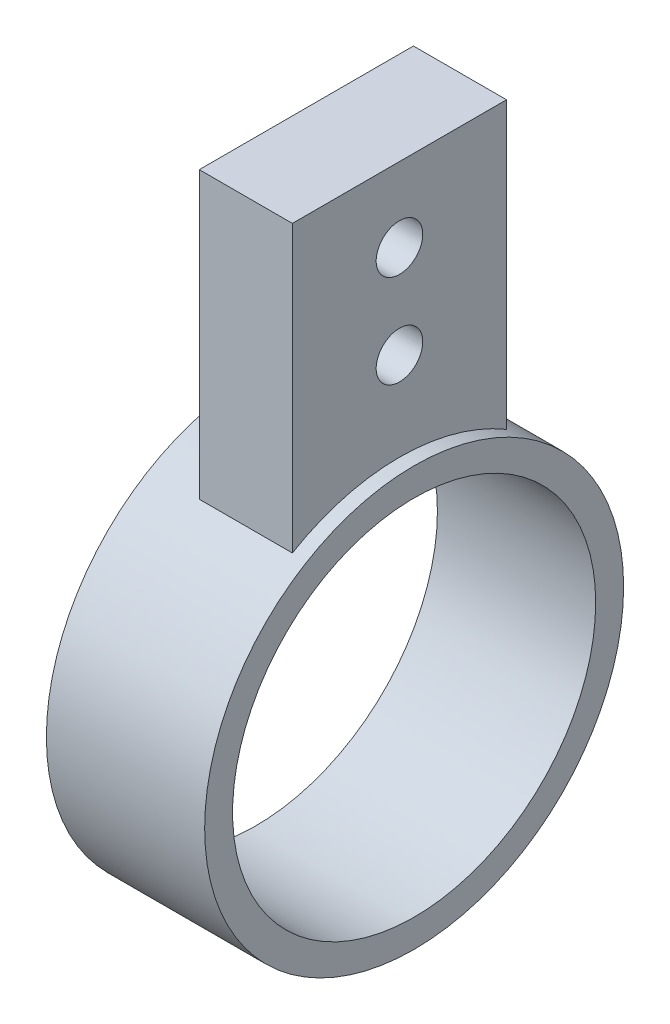
ISO-10303-21;
HEADER;
FILE_DESCRIPTION(('STEP AP214'),'2;1');
FILE_NAME('part.step','',(''),(''),'','','');
FILE_SCHEMA(('AUTOMOTIVE_DESIGN { 1 0 10303 214 1 1 1 1 }'));
ENDSEC;
DATA;
#1=APPLICATION_CONTEXT('core data for automotive mechanical design processes');
#2=APPLICATION_PROTOCOL_DEFINITION('international standard','automotive_design',2000,#1);
#3=PRODUCT_CONTEXT('',#1,'mechanical');
#4=PRODUCT('Part','Part','',(#3));
#5=PRODUCT_RELATED_PRODUCT_CATEGORY('part','',(#4));
#6=PRODUCT_DEFINITION_FORMATION('','',#4);
#7=PRODUCT_DEFINITION_CONTEXT('part definition',#1,'design');
#8=PRODUCT_DEFINITION('design','',#6,#7);
#9=PRODUCT_DEFINITION_SHAPE('','',#8);
#10=(LENGTH_UNIT() NAMED_UNIT(*) SI_UNIT(.MILLI.,.METRE.));
#11=(NAMED_UNIT(*) PLANE_ANGLE_UNIT() SI_UNIT($,.RADIAN.));
#12=(NAMED_UNIT(*) SI_UNIT($,.STERADIAN.) SOLID_ANGLE_UNIT());
#13=UNCERTAINTY_MEASURE_WITH_UNIT(LENGTH_MEASURE(1.E-05),#10,'distance_accuracy_value','');
#14=(GEOMETRIC_REPRESENTATION_CONTEXT(3) GLOBAL_UNCERTAINTY_ASSIGNED_CONTEXT((#13)) GLOBAL_UNIT_ASSIGNED_CONTEXT((#10,
#11,#12)) REPRESENTATION_CONTEXT('',''));
#15=CARTESIAN_POINT('',(0.,0.,0.));
#16=DIRECTION('',(0.,0.,1.));
#17=DIRECTION('',(1.,0.,0.));
#18=AXIS2_PLACEMENT_3D('',#15,#16,#17);
#19=CARTESIAN_POINT('',(8.5,0.,0.));
#20=DIRECTION('',(-1.,0.,0.));
#21=DIRECTION('',(0.,0.,1.));
#22=AXIS2_PLACEMENT_3D('',#19,#20,#21);
#23=CYLINDRICAL_SURFACE('',#22,22.5);
#24=DIRECTION('',(-1.,0.,0.));
#25=VECTOR('',#24,1.);
#26=CARTESIAN_POINT('',(8.5,19.3390796058137,-11.5));
#27=LINE('',#26,#25);
#28=CARTESIAN_POINT('',(6.92320450000446,19.3390796058137,-11.5));
#29=VERTEX_POINT('',#28);
#30=CARTESIAN_POINT('',(-3.07679549999553,19.3390796058137,-11.5));
#31=VERTEX_POINT('',#30);
#32=EDGE_CURVE('E110',#29,#31,#27,.T.);
#33=ORIENTED_EDGE('',*,*,#32,.F.);
#34=CARTESIAN_POINT('',(6.92320450000447,0.,0.));
#35=DIRECTION('',(1.,0.,0.));
#36=DIRECTION('',(0.,0.,-1.));
#37=AXIS2_PLACEMENT_3D('',#34,#35,#36);
#38=CIRCLE('',#37,22.5);
#39=CARTESIAN_POINT('',(6.92320450000447,19.3390796058137,11.5));
#40=VERTEX_POINT('',#39);
#41=EDGE_CURVE('E58',#40,#29,#38,.F.);
#42=ORIENTED_EDGE('',*,*,#41,.F.);
#43=DIRECTION('',(-1.,0.,0.));
#44=VECTOR('',#43,1.);
#45=CARTESIAN_POINT('',(8.5,19.3390796058137,11.5));
#46=LINE('',#45,#44);
#47=CARTESIAN_POINT('',(-3.07679549999553,19.3390796058137,11.5));
#48=VERTEX_POINT('',#47);
#49=EDGE_CURVE('E105',#48,#40,#46,.F.);
#50=ORIENTED_EDGE('',*,*,#49,.F.);
#51=CARTESIAN_POINT('',(-3.07679549999553,0.,0.));
#52=DIRECTION('',(-1.,0.,0.));
#53=DIRECTION('',(0.,0.,1.));
#54=AXIS2_PLACEMENT_3D('',#51,#52,#53);
#55=CIRCLE('',#54,22.5);
#56=EDGE_CURVE('E82',#31,#48,#55,.F.);
#57=ORIENTED_EDGE('',*,*,#56,.F.);
#58=EDGE_LOOP('',(#33,#42,#50,#57));
#59=FACE_BOUND('',#58,.T.);
#60=CARTESIAN_POINT('',(8.5,0.,0.));
#61=DIRECTION('',(1.,0.,0.));
#62=DIRECTION('',(0.,0.,-1.));
#63=AXIS2_PLACEMENT_3D('',#60,#61,#62);
#64=CIRCLE('',#63,22.5);
#65=CARTESIAN_POINT('',(8.5,0.,-22.5));
#66=VERTEX_POINT('',#65);
#67=EDGE_CURVE('E11',#66,#66,#64,.T.);
#68=ORIENTED_EDGE('',*,*,#67,.F.);
#69=EDGE_LOOP('',(#68));
#70=FACE_BOUND('',#69,.T.);
#71=CARTESIAN_POINT('',(-8.5,0.,0.));
#72=DIRECTION('',(1.,0.,0.));
#73=DIRECTION('',(0.,0.,-1.));
#74=AXIS2_PLACEMENT_3D('',#71,#72,#73);
#75=CIRCLE('',#74,22.5);
#76=CARTESIAN_POINT('',(-8.5,0.,-22.5));
#77=VERTEX_POINT('',#76);
#78=EDGE_CURVE('E42',#77,#77,#75,.T.);
#79=ORIENTED_EDGE('',*,*,#78,.T.);
#80=EDGE_LOOP('',(#79));
#81=FACE_BOUND('',#80,.T.);
#82=ADVANCED_FACE('F34',(#59,#70,#81),#23,.T.);
#83=CARTESIAN_POINT('',(8.5,0.,0.));
#84=DIRECTION('',(1.,0.,0.));
#85=DIRECTION('',(0.,0.,-1.));
#86=AXIS2_PLACEMENT_3D('',#83,#84,#85);
#87=PLANE('',#86);
#88=CARTESIAN_POINT('',(8.5,0.,0.));
#89=DIRECTION('',(1.,0.,0.));
#90=DIRECTION('',(0.,0.,-1.));
#91=AXIS2_PLACEMENT_3D('',#88,#89,#90);
#92=CIRCLE('',#91,19.5);
#93=CARTESIAN_POINT('',(8.5,0.,-19.5));
#94=VERTEX_POINT('',#93);
#95=EDGE_CURVE('E128',#94,#94,#92,.T.);
#96=ORIENTED_EDGE('',*,*,#95,.F.);
#97=EDGE_LOOP('',(#96));
#98=FACE_BOUND('',#97,.T.);
#99=ORIENTED_EDGE('',*,*,#67,.T.);
#100=EDGE_LOOP('',(#99));
#101=FACE_BOUND('',#100,.T.);
#102=ADVANCED_FACE('F144',(#98,#101),#87,.T.);
#103=CARTESIAN_POINT('',(-8.5,0.,0.));
#104=DIRECTION('',(1.,0.,0.));
#105=DIRECTION('',(0.,0.,-1.));
#106=AXIS2_PLACEMENT_3D('',#103,#104,#105);
#107=PLANE('',#106);
#108=CARTESIAN_POINT('',(-8.5,0.,0.));
#109=DIRECTION('',(1.,0.,0.));
#110=DIRECTION('',(0.,0.,-1.));
#111=AXIS2_PLACEMENT_3D('',#108,#109,#110);
#112=CIRCLE('',#111,19.5);
#113=CARTESIAN_POINT('',(-8.5,0.,-19.5));
#114=VERTEX_POINT('',#113);
#115=EDGE_CURVE('E126',#114,#114,#112,.T.);
#116=ORIENTED_EDGE('',*,*,#115,.T.);
#117=EDGE_LOOP('',(#116));
#118=FACE_BOUND('',#117,.T.);
#119=ORIENTED_EDGE('',*,*,#78,.F.);
#120=EDGE_LOOP('',(#119));
#121=FACE_BOUND('',#120,.T.);
#122=ADVANCED_FACE('F134',(#118,#121),#107,.F.);
#123=CARTESIAN_POINT('',(-3.07679549999554,-22.502,-11.5));
#124=DIRECTION('',(0.,0.,-1.));
#125=DIRECTION('',(-1.,0.,0.));
#126=AXIS2_PLACEMENT_3D('',#123,#124,#125);
#127=PLANE('',#126);
#128=DIRECTION('',(0.,1.,0.));
#129=VECTOR('',#128,1.);
#130=CARTESIAN_POINT('',(6.92320450000446,-22.502,-11.5));
#131=LINE('',#130,#129);
#132=CARTESIAN_POINT('',(6.92320450000446,50.,-11.5));
#133=VERTEX_POINT('',#132);
#134=EDGE_CURVE('E103',#29,#133,#131,.T.);
#135=ORIENTED_EDGE('',*,*,#134,.F.);
#136=ORIENTED_EDGE('',*,*,#32,.T.);
#137=DIRECTION('',(0.,1.,0.));
#138=VECTOR('',#137,1.);
#139=CARTESIAN_POINT('',(-3.07679549999554,-22.502,-11.5));
#140=LINE('',#139,#138);
#141=CARTESIAN_POINT('',(-3.07679549999554,50.,-11.5));
#142=VERTEX_POINT('',#141);
#143=EDGE_CURVE('E50',#31,#142,#140,.T.);
#144=ORIENTED_EDGE('',*,*,#143,.T.);
#145=DIRECTION('',(-1.,0.,0.));
#146=VECTOR('',#145,1.);
#147=CARTESIAN_POINT('',(-3.07679549999554,50.,-11.5));
#148=LINE('',#147,#146);
#149=EDGE_CURVE('E97',#133,#142,#148,.T.);
#150=ORIENTED_EDGE('',*,*,#149,.F.);
#151=EDGE_LOOP('',(#135,#136,#144,#150));
#152=FACE_BOUND('',#151,.T.);
#153=ADVANCED_FACE('F155',(#152),#127,.T.);
#154=CARTESIAN_POINT('',(-3.07679549999553,-22.502,11.5));
#155=DIRECTION('',(0.,0.,1.));
#156=DIRECTION('',(1.,0.,0.));
#157=AXIS2_PLACEMENT_3D('',#154,#155,#156);
#158=PLANE('',#157);
#159=DIRECTION('',(0.,1.,0.));
#160=VECTOR('',#159,1.);
#161=CARTESIAN_POINT('',(-3.07679549999553,-22.502,11.5));
#162=LINE('',#161,#160);
#163=CARTESIAN_POINT('',(-3.07679549999553,50.,11.5));
#164=VERTEX_POINT('',#163);
#165=EDGE_CURVE('E75',#48,#164,#162,.T.);
#166=ORIENTED_EDGE('',*,*,#165,.F.);
#167=ORIENTED_EDGE('',*,*,#49,.T.);
#168=DIRECTION('',(0.,1.,0.));
#169=VECTOR('',#168,1.);
#170=CARTESIAN_POINT('',(6.92320450000447,-22.502,11.5));
#171=LINE('',#170,#169);
#172=CARTESIAN_POINT('',(6.92320450000447,50.,11.5));
#173=VERTEX_POINT('',#172);
#174=EDGE_CURVE('E85',#40,#173,#171,.T.);
#175=ORIENTED_EDGE('',*,*,#174,.T.);
#176=DIRECTION('',(1.,0.,0.));
#177=VECTOR('',#176,1.);
#178=CARTESIAN_POINT('',(-3.07679549999553,50.,11.5));
#179=LINE('',#178,#177);
#180=EDGE_CURVE('E88',#164,#173,#179,.T.);
#181=ORIENTED_EDGE('',*,*,#180,.F.);
#182=EDGE_LOOP('',(#166,#167,#175,#181));
#183=FACE_BOUND('',#182,.T.);
#184=ADVANCED_FACE('F89',(#183),#158,.T.);
#185=CARTESIAN_POINT('',(6.92320450000446,-22.502,-11.5));
#186=DIRECTION('',(1.,0.,0.));
#187=DIRECTION('',(0.,0.,-1.));
#188=AXIS2_PLACEMENT_3D('',#185,#186,#187);
#189=PLANE('',#188);
#190=CARTESIAN_POINT('',(6.92320450000447,42.,0.));
#191=DIRECTION('',(1.,0.,0.));
#192=DIRECTION('',(0.,0.,-1.));
#193=AXIS2_PLACEMENT_3D('',#190,#191,#192);
#194=CIRCLE('',#193,2.5);
#195=CARTESIAN_POINT('',(6.92320450000447,42.,-2.5));
#196=VERTEX_POINT('',#195);
#197=EDGE_CURVE('E116',#196,#196,#194,.T.);
#198=ORIENTED_EDGE('',*,*,#197,.F.);
#199=EDGE_LOOP('',(#198));
#200=FACE_BOUND('',#199,.T.);
#201=CARTESIAN_POINT('',(6.92320450000447,32.,0.));
#202=DIRECTION('',(1.,0.,0.));
#203=DIRECTION('',(0.,0.,-1.));
#204=AXIS2_PLACEMENT_3D('',#201,#202,#203);
#205=CIRCLE('',#204,2.5);
#206=CARTESIAN_POINT('',(6.92320450000447,32.,-2.5));
#207=VERTEX_POINT('',#206);
#208=EDGE_CURVE('E121',#207,#207,#205,.T.);
#209=ORIENTED_EDGE('',*,*,#208,.F.);
#210=EDGE_LOOP('',(#209));
#211=FACE_BOUND('',#210,.T.);
#212=ORIENTED_EDGE('',*,*,#174,.F.);
#213=ORIENTED_EDGE('',*,*,#41,.T.);
#214=ORIENTED_EDGE('',*,*,#134,.T.);
#215=DIRECTION('',(0.,0.,-1.));
#216=VECTOR('',#215,1.);
#217=CARTESIAN_POINT('',(6.92320450000446,50.,-11.5));
#218=LINE('',#217,#216);
#219=EDGE_CURVE('E93',#173,#133,#218,.T.);
#220=ORIENTED_EDGE('',*,*,#219,.F.);
#221=EDGE_LOOP('',(#212,#213,#214,#220));
#222=FACE_BOUND('',#221,.T.);
#223=ADVANCED_FACE('F169',(#200,#211,#222),#189,.T.);
#224=CARTESIAN_POINT('',(-3.07679549999554,-22.502,-11.5));
#225=DIRECTION('',(-1.,0.,0.));
#226=DIRECTION('',(0.,0.,1.));
#227=AXIS2_PLACEMENT_3D('',#224,#225,#226);
#228=PLANE('',#227);
#229=CARTESIAN_POINT('',(-3.07679549999553,42.,0.));
#230=DIRECTION('',(-1.,0.,0.));
#231=DIRECTION('',(0.,0.,1.));
#232=AXIS2_PLACEMENT_3D('',#229,#230,#231);
#233=CIRCLE('',#232,2.5);
#234=CARTESIAN_POINT('',(-3.07679549999553,42.,2.5));
#235=VERTEX_POINT('',#234);
#236=EDGE_CURVE('E37',#235,#235,#233,.T.);
#237=ORIENTED_EDGE('',*,*,#236,.F.);
#238=EDGE_LOOP('',(#237));
#239=FACE_BOUND('',#238,.T.);
#240=CARTESIAN_POINT('',(-3.07679549999553,32.,0.));
#241=DIRECTION('',(-1.,0.,0.));
#242=DIRECTION('',(0.,0.,1.));
#243=AXIS2_PLACEMENT_3D('',#240,#241,#242);
#244=CIRCLE('',#243,2.5);
#245=CARTESIAN_POINT('',(-3.07679549999553,32.,2.5));
#246=VERTEX_POINT('',#245);
#247=EDGE_CURVE('E114',#246,#246,#244,.T.);
#248=ORIENTED_EDGE('',*,*,#247,.F.);
#249=EDGE_LOOP('',(#248));
#250=FACE_BOUND('',#249,.T.);
#251=ORIENTED_EDGE('',*,*,#143,.F.);
#252=ORIENTED_EDGE('',*,*,#56,.T.);
#253=ORIENTED_EDGE('',*,*,#165,.T.);
#254=DIRECTION('',(0.,0.,1.));
#255=VECTOR('',#254,1.);
#256=CARTESIAN_POINT('',(-3.07679549999554,50.,-11.5));
#257=LINE('',#256,#255);
#258=EDGE_CURVE('E79',#142,#164,#257,.T.);
#259=ORIENTED_EDGE('',*,*,#258,.F.);
#260=EDGE_LOOP('',(#251,#252,#253,#259));
#261=FACE_BOUND('',#260,.T.);
#262=ADVANCED_FACE('F77',(#239,#250,#261),#228,.T.);
#263=CARTESIAN_POINT('',(0.,50.,0.));
#264=DIRECTION('',(0.,1.,0.));
#265=DIRECTION('',(0.,0.,1.));
#266=AXIS2_PLACEMENT_3D('',#263,#264,#265);
#267=PLANE('',#266);
#268=ORIENTED_EDGE('',*,*,#219,.T.);
#269=ORIENTED_EDGE('',*,*,#149,.T.);
#270=ORIENTED_EDGE('',*,*,#258,.T.);
#271=ORIENTED_EDGE('',*,*,#180,.T.);
#272=EDGE_LOOP('',(#268,#269,#270,#271));
#273=FACE_BOUND('',#272,.T.);
#274=ADVANCED_FACE('F95',(#273),#267,.T.);
#275=CARTESIAN_POINT('',(-8.5,32.,0.));
#276=DIRECTION('',(1.,0.,0.));
#277=DIRECTION('',(0.,0.,-1.));
#278=AXIS2_PLACEMENT_3D('',#275,#276,#277);
#279=CYLINDRICAL_SURFACE('',#278,2.5);
#280=ORIENTED_EDGE('',*,*,#247,.T.);
#281=EDGE_LOOP('',(#280));
#282=FACE_BOUND('',#281,.T.);
#283=ORIENTED_EDGE('',*,*,#208,.T.);
#284=EDGE_LOOP('',(#283));
#285=FACE_BOUND('',#284,.T.);
#286=ADVANCED_FACE('F161',(#282,#285),#279,.F.);
#287=CARTESIAN_POINT('',(-8.5,42.,0.));
#288=DIRECTION('',(1.,0.,0.));
#289=DIRECTION('',(0.,0.,-1.));
#290=AXIS2_PLACEMENT_3D('',#287,#288,#289);
#291=CYLINDRICAL_SURFACE('',#290,2.5);
#292=ORIENTED_EDGE('',*,*,#236,.T.);
#293=EDGE_LOOP('',(#292));
#294=FACE_BOUND('',#293,.T.);
#295=ORIENTED_EDGE('',*,*,#197,.T.);
#296=EDGE_LOOP('',(#295));
#297=FACE_BOUND('',#296,.T.);
#298=ADVANCED_FACE('F140',(#294,#297),#291,.F.);
#299=CARTESIAN_POINT('',(-8.5,0.,0.));
#300=DIRECTION('',(1.,0.,0.));
#301=DIRECTION('',(0.,0.,-1.));
#302=AXIS2_PLACEMENT_3D('',#299,#300,#301);
#303=CYLINDRICAL_SURFACE('',#302,19.5);
#304=ORIENTED_EDGE('',*,*,#115,.F.);
#305=EDGE_LOOP('',(#304));
#306=FACE_BOUND('',#305,.T.);
#307=ORIENTED_EDGE('',*,*,#95,.T.);
#308=EDGE_LOOP('',(#307));
#309=FACE_BOUND('',#308,.T.);
#310=ADVANCED_FACE('F137',(#306,#309),#303,.F.);
#311=CLOSED_SHELL('',(#82,#102,#122,#153,#184,#223,#262,#274,#286,#298,#310));
#312=MANIFOLD_SOLID_BREP('B2',#311);
#313=ADVANCED_BREP_SHAPE_REPRESENTATION('',(#18,#312),#14);
#314=SHAPE_DEFINITION_REPRESENTATION(#9,#313);
ENDSEC;
END-ISO-10303-21;
